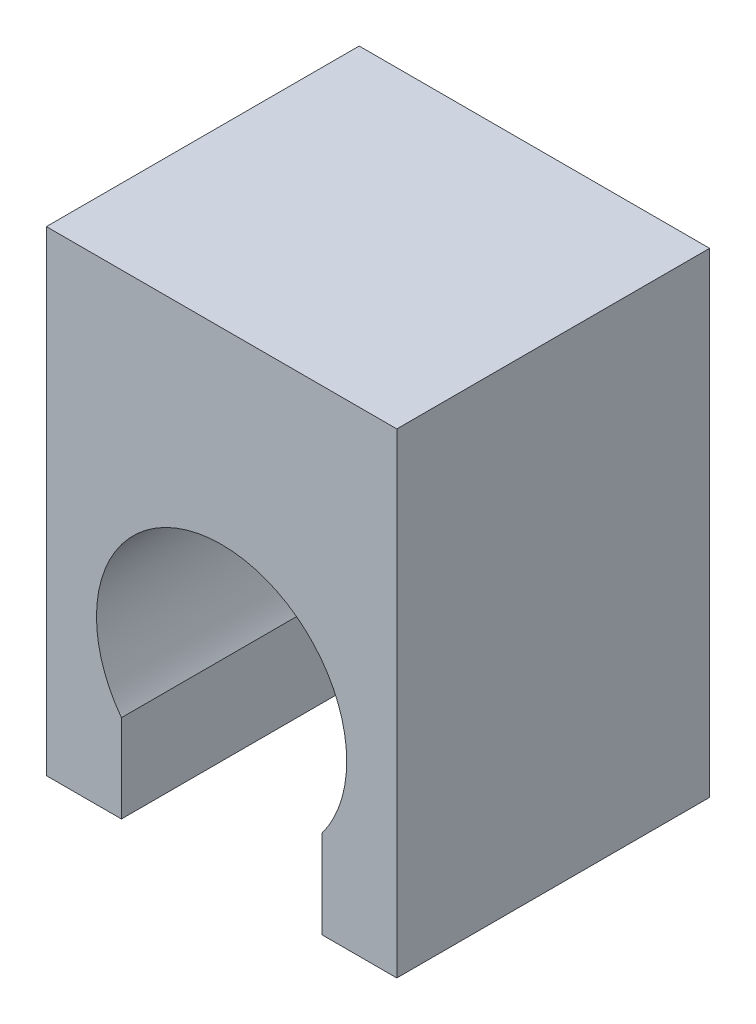
ISO-10303-21;
HEADER;
FILE_DESCRIPTION(('STEP AP214'),'2;1');
FILE_NAME('part.step','',(''),(''),'','','');
FILE_SCHEMA(('AUTOMOTIVE_DESIGN { 1 0 10303 214 1 1 1 1 }'));
ENDSEC;
DATA;
#1=APPLICATION_CONTEXT('core data for automotive mechanical design processes');
#2=APPLICATION_PROTOCOL_DEFINITION('international standard','automotive_design',2000,#1);
#3=PRODUCT_CONTEXT('',#1,'mechanical');
#4=PRODUCT('Part','Part','',(#3));
#5=PRODUCT_RELATED_PRODUCT_CATEGORY('part','',(#4));
#6=PRODUCT_DEFINITION_FORMATION('','',#4);
#7=PRODUCT_DEFINITION_CONTEXT('part definition',#1,'design');
#8=PRODUCT_DEFINITION('design','',#6,#7);
#9=PRODUCT_DEFINITION_SHAPE('','',#8);
#10=(LENGTH_UNIT() NAMED_UNIT(*) SI_UNIT(.MILLI.,.METRE.));
#11=(NAMED_UNIT(*) PLANE_ANGLE_UNIT() SI_UNIT($,.RADIAN.));
#12=(NAMED_UNIT(*) SI_UNIT($,.STERADIAN.) SOLID_ANGLE_UNIT());
#13=UNCERTAINTY_MEASURE_WITH_UNIT(LENGTH_MEASURE(1.E-05),#10,'distance_accuracy_value','');
#14=(GEOMETRIC_REPRESENTATION_CONTEXT(3) GLOBAL_UNCERTAINTY_ASSIGNED_CONTEXT((#13)) GLOBAL_UNIT_ASSIGNED_CONTEXT((#10,
#11,#12)) REPRESENTATION_CONTEXT('',''));
#15=CARTESIAN_POINT('',(0.,0.,0.));
#16=DIRECTION('',(0.,0.,1.));
#17=DIRECTION('',(1.,0.,0.));
#18=AXIS2_PLACEMENT_3D('',#15,#16,#17);
#19=CARTESIAN_POINT('',(-6.39971769970124,2.11362520689541,10.));
#20=DIRECTION('',(-1.,0.,0.));
#21=DIRECTION('',(0.,0.,1.));
#22=AXIS2_PLACEMENT_3D('',#19,#20,#21);
#23=PLANE('',#22);
#24=DIRECTION('',(0.,1.,0.));
#25=VECTOR('',#24,1.);
#26=CARTESIAN_POINT('',(-6.39971769970124,2.11362520689541,0.));
#27=LINE('',#26,#25);
#28=CARTESIAN_POINT('',(-6.39971769970124,2.11362520689541,0.));
#29=VERTEX_POINT('',#28);
#30=CARTESIAN_POINT('',(-6.39971769970124,17.3161057151945,0.));
#31=VERTEX_POINT('',#30);
#32=EDGE_CURVE('E132',#29,#31,#27,.T.);
#33=ORIENTED_EDGE('',*,*,#32,.F.);
#34=DIRECTION('',(0.,0.,-1.));
#35=VECTOR('',#34,1.);
#36=CARTESIAN_POINT('',(-6.39971769970124,2.11362520689541,10.));
#37=LINE('',#36,#35);
#38=CARTESIAN_POINT('',(-6.39971769970124,2.11362520689541,10.));
#39=VERTEX_POINT('',#38);
#40=EDGE_CURVE('E11',#39,#29,#37,.T.);
#41=ORIENTED_EDGE('',*,*,#40,.F.);
#42=DIRECTION('',(0.,1.,0.));
#43=VECTOR('',#42,1.);
#44=CARTESIAN_POINT('',(-6.39971769970124,2.11362520689541,10.));
#45=LINE('',#44,#43);
#46=CARTESIAN_POINT('',(-6.39971769970124,17.3161057151945,10.));
#47=VERTEX_POINT('',#46);
#48=EDGE_CURVE('E157',#39,#47,#45,.T.);
#49=ORIENTED_EDGE('',*,*,#48,.T.);
#50=DIRECTION('',(0.,0.,1.));
#51=VECTOR('',#50,1.);
#52=CARTESIAN_POINT('',(-6.39971769970124,17.3161057151945,0.));
#53=LINE('',#52,#51);
#54=EDGE_CURVE('E200',#31,#47,#53,.T.);
#55=ORIENTED_EDGE('',*,*,#54,.F.);
#56=EDGE_LOOP('',(#33,#41,#49,#55));
#57=FACE_BOUND('',#56,.T.);
#58=ADVANCED_FACE('F39',(#57),#23,.T.);
#59=CARTESIAN_POINT('',(-4.00084601426926,2.11362520689541,10.));
#60=DIRECTION('',(0.,-1.,0.));
#61=DIRECTION('',(0.,0.,-1.));
#62=AXIS2_PLACEMENT_3D('',#59,#60,#61);
#63=PLANE('',#62);
#64=DIRECTION('',(-1.,0.,0.));
#65=VECTOR('',#64,1.);
#66=CARTESIAN_POINT('',(-4.00084601426926,2.11362520689541,0.));
#67=LINE('',#66,#65);
#68=CARTESIAN_POINT('',(-4.00084601426926,2.11362520689541,0.));
#69=VERTEX_POINT('',#68);
#70=EDGE_CURVE('E154',#69,#29,#67,.T.);
#71=ORIENTED_EDGE('',*,*,#70,.F.);
#72=DIRECTION('',(0.,0.,-1.));
#73=VECTOR('',#72,1.);
#74=CARTESIAN_POINT('',(-4.00084601426926,2.11362520689541,10.));
#75=LINE('',#74,#73);
#76=CARTESIAN_POINT('',(-4.00084601426926,2.11362520689541,10.));
#77=VERTEX_POINT('',#76);
#78=EDGE_CURVE('E49',#77,#69,#75,.T.);
#79=ORIENTED_EDGE('',*,*,#78,.F.);
#80=DIRECTION('',(-1.,0.,0.));
#81=VECTOR('',#80,1.);
#82=CARTESIAN_POINT('',(-4.00084601426926,2.11362520689541,10.));
#83=LINE('',#82,#81);
#84=EDGE_CURVE('E117',#77,#39,#83,.T.);
#85=ORIENTED_EDGE('',*,*,#84,.T.);
#86=ORIENTED_EDGE('',*,*,#40,.T.);
#87=EDGE_LOOP('',(#71,#79,#85,#86));
#88=FACE_BOUND('',#87,.T.);
#89=ADVANCED_FACE('F192',(#88),#63,.T.);
#90=CARTESIAN_POINT('',(-4.00084601426926,4.91911750471985,10.));
#91=DIRECTION('',(1.,0.,0.));
#92=DIRECTION('',(0.,0.,-1.));
#93=AXIS2_PLACEMENT_3D('',#90,#91,#92);
#94=PLANE('',#93);
#95=DIRECTION('',(0.,-1.,0.));
#96=VECTOR('',#95,1.);
#97=CARTESIAN_POINT('',(-4.00084601426926,4.91911750471985,0.));
#98=LINE('',#97,#96);
#99=CARTESIAN_POINT('',(-4.00084601426925,4.91911750471985,0.));
#100=VERTEX_POINT('',#99);
#101=EDGE_CURVE('E105',#100,#69,#98,.T.);
#102=ORIENTED_EDGE('',*,*,#101,.F.);
#103=DIRECTION('',(0.,0.,-1.));
#104=VECTOR('',#103,1.);
#105=CARTESIAN_POINT('',(-4.00084601426925,4.91911750471985,10.));
#106=LINE('',#105,#104);
#107=CARTESIAN_POINT('',(-4.00084601426925,4.91911750471985,10.));
#108=VERTEX_POINT('',#107);
#109=EDGE_CURVE('E100',#108,#100,#106,.T.);
#110=ORIENTED_EDGE('',*,*,#109,.F.);
#111=DIRECTION('',(0.,-1.,0.));
#112=VECTOR('',#111,1.);
#113=CARTESIAN_POINT('',(-4.00084601426926,4.91911750471985,10.));
#114=LINE('',#113,#112);
#115=EDGE_CURVE('E103',#108,#77,#114,.T.);
#116=ORIENTED_EDGE('',*,*,#115,.T.);
#117=ORIENTED_EDGE('',*,*,#78,.T.);
#118=EDGE_LOOP('',(#102,#110,#116,#117));
#119=FACE_BOUND('',#118,.T.);
#120=ADVANCED_FACE('F102',(#119),#94,.T.);
#121=CARTESIAN_POINT('',(-0.798589385133227,7.31610571519448,10.));
#122=DIRECTION('',(0.,0.,-1.));
#123=DIRECTION('',(-1.,0.,0.));
#124=AXIS2_PLACEMENT_3D('',#121,#122,#123);
#125=CYLINDRICAL_SURFACE('',#124,4.);
#126=CARTESIAN_POINT('',(-0.798589385133227,7.31610571519448,0.));
#127=DIRECTION('',(0.,0.,1.));
#128=DIRECTION('',(1.,0.,0.));
#129=AXIS2_PLACEMENT_3D('',#126,#127,#128);
#130=CIRCLE('',#129,4.);
#131=CARTESIAN_POINT('',(2.4036672440028,4.91911750471985,0.));
#132=VERTEX_POINT('',#131);
#133=EDGE_CURVE('E149',#132,#100,#130,.T.);
#134=ORIENTED_EDGE('',*,*,#133,.F.);
#135=DIRECTION('',(0.,0.,-1.));
#136=VECTOR('',#135,1.);
#137=CARTESIAN_POINT('',(2.4036672440028,4.91911750471985,10.));
#138=LINE('',#137,#136);
#139=CARTESIAN_POINT('',(2.4036672440028,4.91911750471985,10.));
#140=VERTEX_POINT('',#139);
#141=EDGE_CURVE('E111',#140,#132,#138,.T.);
#142=ORIENTED_EDGE('',*,*,#141,.F.);
#143=CARTESIAN_POINT('',(-0.798589385133227,7.31610571519448,10.));
#144=DIRECTION('',(0.,0.,1.));
#145=DIRECTION('',(1.,0.,0.));
#146=AXIS2_PLACEMENT_3D('',#143,#144,#145);
#147=CIRCLE('',#146,4.);
#148=EDGE_CURVE('E116',#140,#108,#147,.T.);
#149=ORIENTED_EDGE('',*,*,#148,.T.);
#150=ORIENTED_EDGE('',*,*,#109,.T.);
#151=EDGE_LOOP('',(#134,#142,#149,#150));
#152=FACE_BOUND('',#151,.T.);
#153=ADVANCED_FACE('F120',(#152),#125,.F.);
#154=CARTESIAN_POINT('',(2.4036672440028,4.91911750471985,10.));
#155=DIRECTION('',(1.,0.,0.));
#156=DIRECTION('',(0.,0.,-1.));
#157=AXIS2_PLACEMENT_3D('',#154,#155,#156);
#158=PLANE('',#157);
#159=DIRECTION('',(0.,-1.,0.));
#160=VECTOR('',#159,1.);
#161=CARTESIAN_POINT('',(2.4036672440028,4.91911750471985,0.));
#162=LINE('',#161,#160);
#163=CARTESIAN_POINT('',(2.4036672440028,2.11362520689541,0.));
#164=VERTEX_POINT('',#163);
#165=EDGE_CURVE('E145',#132,#164,#162,.T.);
#166=ORIENTED_EDGE('',*,*,#165,.T.);
#167=DIRECTION('',(0.,0.,-1.));
#168=VECTOR('',#167,1.);
#169=CARTESIAN_POINT('',(2.4036672440028,2.11362520689541,10.));
#170=LINE('',#169,#168);
#171=CARTESIAN_POINT('',(2.4036672440028,2.11362520689541,10.));
#172=VERTEX_POINT('',#171);
#173=EDGE_CURVE('E162',#172,#164,#170,.T.);
#174=ORIENTED_EDGE('',*,*,#173,.F.);
#175=DIRECTION('',(0.,-1.,0.));
#176=VECTOR('',#175,1.);
#177=CARTESIAN_POINT('',(2.4036672440028,4.91911750471985,10.));
#178=LINE('',#177,#176);
#179=EDGE_CURVE('E123',#140,#172,#178,.T.);
#180=ORIENTED_EDGE('',*,*,#179,.F.);
#181=ORIENTED_EDGE('',*,*,#141,.T.);
#182=EDGE_LOOP('',(#166,#174,#180,#181));
#183=FACE_BOUND('',#182,.T.);
#184=ADVANCED_FACE('F183',(#183),#158,.F.);
#185=CARTESIAN_POINT('',(4.80253892943479,2.11362520689541,10.));
#186=DIRECTION('',(0.,-1.,0.));
#187=DIRECTION('',(1.,0.,0.));
#188=AXIS2_PLACEMENT_3D('',#185,#186,#187);
#189=PLANE('',#188);
#190=DIRECTION('',(-1.,0.,0.));
#191=VECTOR('',#190,1.);
#192=CARTESIAN_POINT('',(4.80253892943479,2.11362520689541,0.));
#193=LINE('',#192,#191);
#194=CARTESIAN_POINT('',(4.80253892943479,2.11362520689541,0.));
#195=VERTEX_POINT('',#194);
#196=EDGE_CURVE('E141',#195,#164,#193,.T.);
#197=ORIENTED_EDGE('',*,*,#196,.F.);
#198=DIRECTION('',(0.,0.,-1.));
#199=VECTOR('',#198,1.);
#200=CARTESIAN_POINT('',(4.80253892943479,2.11362520689541,10.));
#201=LINE('',#200,#199);
#202=CARTESIAN_POINT('',(4.80253892943479,2.11362520689541,10.));
#203=VERTEX_POINT('',#202);
#204=EDGE_CURVE('E42',#203,#195,#201,.T.);
#205=ORIENTED_EDGE('',*,*,#204,.F.);
#206=DIRECTION('',(-1.,0.,0.));
#207=VECTOR('',#206,1.);
#208=CARTESIAN_POINT('',(4.80253892943479,2.11362520689541,10.));
#209=LINE('',#208,#207);
#210=EDGE_CURVE('E126',#203,#172,#209,.T.);
#211=ORIENTED_EDGE('',*,*,#210,.T.);
#212=ORIENTED_EDGE('',*,*,#173,.T.);
#213=EDGE_LOOP('',(#197,#205,#211,#212));
#214=FACE_BOUND('',#213,.T.);
#215=ADVANCED_FACE('F181',(#214),#189,.T.);
#216=CARTESIAN_POINT('',(4.80253892943479,2.11362520689541,10.));
#217=DIRECTION('',(-1.,0.,0.));
#218=DIRECTION('',(0.,-1.,0.));
#219=AXIS2_PLACEMENT_3D('',#216,#217,#218);
#220=PLANE('',#219);
#221=DIRECTION('',(0.,1.,0.));
#222=VECTOR('',#221,1.);
#223=CARTESIAN_POINT('',(4.80253892943479,2.11362520689541,0.));
#224=LINE('',#223,#222);
#225=CARTESIAN_POINT('',(4.80253892943479,17.3161057151945,0.));
#226=VERTEX_POINT('',#225);
#227=EDGE_CURVE('E136',#195,#226,#224,.T.);
#228=ORIENTED_EDGE('',*,*,#227,.T.);
#229=DIRECTION('',(0.,0.,-1.));
#230=VECTOR('',#229,1.);
#231=CARTESIAN_POINT('',(4.80253892943479,17.3161057151945,10.));
#232=LINE('',#231,#230);
#233=CARTESIAN_POINT('',(4.80253892943479,17.3161057151945,10.));
#234=VERTEX_POINT('',#233);
#235=EDGE_CURVE('E215',#234,#226,#232,.T.);
#236=ORIENTED_EDGE('',*,*,#235,.F.);
#237=DIRECTION('',(0.,1.,0.));
#238=VECTOR('',#237,1.);
#239=CARTESIAN_POINT('',(4.80253892943479,2.11362520689541,10.));
#240=LINE('',#239,#238);
#241=EDGE_CURVE('E173',#203,#234,#240,.T.);
#242=ORIENTED_EDGE('',*,*,#241,.F.);
#243=ORIENTED_EDGE('',*,*,#204,.T.);
#244=EDGE_LOOP('',(#228,#236,#242,#243));
#245=FACE_BOUND('',#244,.T.);
#246=ADVANCED_FACE('F168',(#245),#220,.F.);
#247=CARTESIAN_POINT('',(-0.798589385133227,7.31610571519448,10.));
#248=DIRECTION('',(0.,0.,1.));
#249=DIRECTION('',(1.,0.,0.));
#250=AXIS2_PLACEMENT_3D('',#247,#248,#249);
#251=PLANE('',#250);
#252=ORIENTED_EDGE('',*,*,#48,.F.);
#253=ORIENTED_EDGE('',*,*,#84,.F.);
#254=ORIENTED_EDGE('',*,*,#115,.F.);
#255=ORIENTED_EDGE('',*,*,#148,.F.);
#256=ORIENTED_EDGE('',*,*,#179,.T.);
#257=ORIENTED_EDGE('',*,*,#210,.F.);
#258=ORIENTED_EDGE('',*,*,#241,.T.);
#259=DIRECTION('',(1.,0.,0.));
#260=VECTOR('',#259,1.);
#261=CARTESIAN_POINT('',(-6.39971769970124,17.3161057151945,10.));
#262=LINE('',#261,#260);
#263=EDGE_CURVE('E137',#47,#234,#262,.T.);
#264=ORIENTED_EDGE('',*,*,#263,.F.);
#265=EDGE_LOOP('',(#252,#253,#254,#255,#256,#257,#258,#264));
#266=FACE_BOUND('',#265,.T.);
#267=ADVANCED_FACE('F115',(#266),#251,.T.);
#268=CARTESIAN_POINT('',(-0.798589385133227,7.31610571519448,0.));
#269=DIRECTION('',(0.,0.,1.));
#270=DIRECTION('',(1.,0.,0.));
#271=AXIS2_PLACEMENT_3D('',#268,#269,#270);
#272=PLANE('',#271);
#273=ORIENTED_EDGE('',*,*,#32,.T.);
#274=DIRECTION('',(-1.,0.,0.));
#275=VECTOR('',#274,1.);
#276=CARTESIAN_POINT('',(4.80253892943479,17.3161057151945,0.));
#277=LINE('',#276,#275);
#278=EDGE_CURVE('E179',#226,#31,#277,.T.);
#279=ORIENTED_EDGE('',*,*,#278,.F.);
#280=ORIENTED_EDGE('',*,*,#227,.F.);
#281=ORIENTED_EDGE('',*,*,#196,.T.);
#282=ORIENTED_EDGE('',*,*,#165,.F.);
#283=ORIENTED_EDGE('',*,*,#133,.T.);
#284=ORIENTED_EDGE('',*,*,#101,.T.);
#285=ORIENTED_EDGE('',*,*,#70,.T.);
#286=EDGE_LOOP('',(#273,#279,#280,#281,#282,#283,#284,#285));
#287=FACE_BOUND('',#286,.T.);
#288=ADVANCED_FACE('F176',(#287),#272,.F.);
#289=CARTESIAN_POINT('',(0.,17.3161057151945,0.));
#290=DIRECTION('',(0.,1.,0.));
#291=DIRECTION('',(0.,0.,1.));
#292=AXIS2_PLACEMENT_3D('',#289,#290,#291);
#293=PLANE('',#292);
#294=ORIENTED_EDGE('',*,*,#235,.T.);
#295=ORIENTED_EDGE('',*,*,#278,.T.);
#296=ORIENTED_EDGE('',*,*,#54,.T.);
#297=ORIENTED_EDGE('',*,*,#263,.T.);
#298=EDGE_LOOP('',(#294,#295,#296,#297));
#299=FACE_BOUND('',#298,.T.);
#300=ADVANCED_FACE('F218',(#299),#293,.T.);
#301=CLOSED_SHELL('',(#58,#89,#120,#153,#184,#215,#246,#267,#288,#300));
#302=MANIFOLD_SOLID_BREP('B2',#301);
#303=ADVANCED_BREP_SHAPE_REPRESENTATION('',(#18,#302),#14);
#304=SHAPE_DEFINITION_REPRESENTATION(#9,#303);
ENDSEC;
END-ISO-10303-21;
